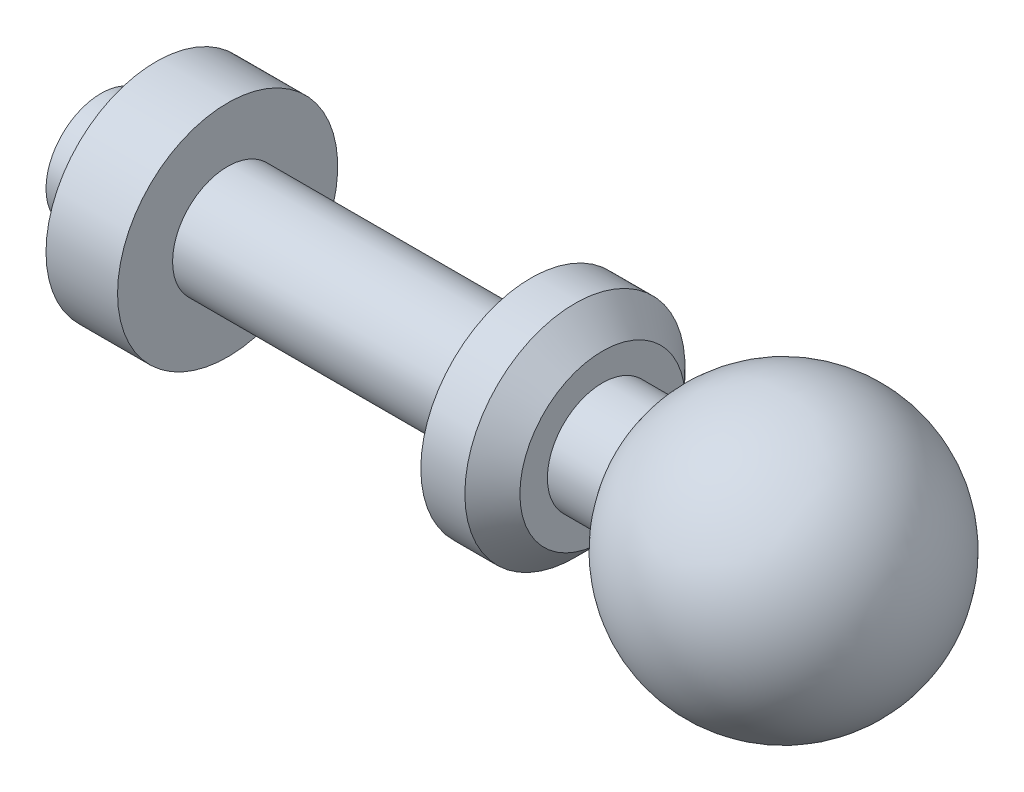
ISO-10303-21;
HEADER;
FILE_DESCRIPTION(('STEP AP214'),'2;1');
FILE_NAME('part.step','',(''),(''),'','','');
FILE_SCHEMA(('AUTOMOTIVE_DESIGN { 1 0 10303 214 1 1 1 1 }'));
ENDSEC;
DATA;
#1=APPLICATION_CONTEXT('core data for automotive mechanical design processes');
#2=APPLICATION_PROTOCOL_DEFINITION('international standard','automotive_design',2000,#1);
#3=PRODUCT_CONTEXT('',#1,'mechanical');
#4=PRODUCT('Part','Part','',(#3));
#5=PRODUCT_RELATED_PRODUCT_CATEGORY('part','',(#4));
#6=PRODUCT_DEFINITION_FORMATION('','',#4);
#7=PRODUCT_DEFINITION_CONTEXT('part definition',#1,'design');
#8=PRODUCT_DEFINITION('design','',#6,#7);
#9=PRODUCT_DEFINITION_SHAPE('','',#8);
#10=(LENGTH_UNIT() NAMED_UNIT(*) SI_UNIT(.MILLI.,.METRE.));
#11=(NAMED_UNIT(*) PLANE_ANGLE_UNIT() SI_UNIT($,.RADIAN.));
#12=(NAMED_UNIT(*) SI_UNIT($,.STERADIAN.) SOLID_ANGLE_UNIT());
#13=UNCERTAINTY_MEASURE_WITH_UNIT(LENGTH_MEASURE(1.E-05),#10,'distance_accuracy_value','');
#14=(GEOMETRIC_REPRESENTATION_CONTEXT(3) GLOBAL_UNCERTAINTY_ASSIGNED_CONTEXT((#13)) GLOBAL_UNIT_ASSIGNED_CONTEXT((#10,
#11,#12)) REPRESENTATION_CONTEXT('',''));
#15=CARTESIAN_POINT('',(0.,0.,0.));
#16=DIRECTION('',(0.,0.,1.));
#17=DIRECTION('',(1.,0.,0.));
#18=AXIS2_PLACEMENT_3D('',#15,#16,#17);
#19=CARTESIAN_POINT('',(124.012878474779,0.,0.));
#20=DIRECTION('',(-1.,0.,0.));
#21=DIRECTION('',(0.,1.,0.));
#22=AXIS2_PLACEMENT_3D('',#19,#20,#21);
#23=SPHERICAL_SURFACE('',#22,25.);
#24=CARTESIAN_POINT('',(101.1,0.,0.));
#25=DIRECTION('',(-1.,0.,0.));
#26=DIRECTION('',(0.,0.,1.));
#27=AXIS2_PLACEMENT_3D('',#24,#25,#26);
#28=CIRCLE('',#27,10.);
#29=CARTESIAN_POINT('',(101.1,0.,10.));
#30=VERTEX_POINT('',#29);
#31=EDGE_CURVE('E10',#30,#30,#28,.T.);
#32=ORIENTED_EDGE('',*,*,#31,.F.);
#33=EDGE_LOOP('',(#32));
#34=FACE_BOUND('',#33,.T.);
#35=ADVANCED_FACE('F31',(#34),#23,.T.);
#36=CARTESIAN_POINT('',(0.,0.,0.));
#37=DIRECTION('',(-1.,0.,0.));
#38=DIRECTION('',(0.,0.,1.));
#39=AXIS2_PLACEMENT_3D('',#36,#37,#38);
#40=CYLINDRICAL_SURFACE('',#39,10.);
#41=CARTESIAN_POINT('',(91.1,0.,0.));
#42=DIRECTION('',(-1.,0.,0.));
#43=DIRECTION('',(0.,0.,1.));
#44=AXIS2_PLACEMENT_3D('',#41,#42,#43);
#45=CIRCLE('',#44,10.);
#46=CARTESIAN_POINT('',(91.1,0.,10.));
#47=VERTEX_POINT('',#46);
#48=EDGE_CURVE('E37',#47,#47,#45,.T.);
#49=ORIENTED_EDGE('',*,*,#48,.F.);
#50=EDGE_LOOP('',(#49));
#51=FACE_BOUND('',#50,.T.);
#52=ORIENTED_EDGE('',*,*,#31,.T.);
#53=EDGE_LOOP('',(#52));
#54=FACE_BOUND('',#53,.T.);
#55=ADVANCED_FACE('F124',(#51,#54),#40,.T.);
#56=CARTESIAN_POINT('',(91.1,15.,0.));
#57=DIRECTION('',(-1.,0.,0.));
#58=DIRECTION('',(0.,0.,1.));
#59=AXIS2_PLACEMENT_3D('',#56,#57,#58);
#60=PLANE('',#59);
#61=CARTESIAN_POINT('',(91.1,0.,0.));
#62=DIRECTION('',(-1.,0.,0.));
#63=DIRECTION('',(0.,0.,1.));
#64=AXIS2_PLACEMENT_3D('',#61,#62,#63);
#65=CIRCLE('',#64,15.);
#66=CARTESIAN_POINT('',(91.1,0.,15.));
#67=VERTEX_POINT('',#66);
#68=EDGE_CURVE('E41',#67,#67,#65,.T.);
#69=ORIENTED_EDGE('',*,*,#68,.F.);
#70=EDGE_LOOP('',(#69));
#71=FACE_BOUND('',#70,.T.);
#72=ORIENTED_EDGE('',*,*,#48,.T.);
#73=EDGE_LOOP('',(#72));
#74=FACE_BOUND('',#73,.T.);
#75=ADVANCED_FACE('F119',(#71,#74),#60,.F.);
#76=CARTESIAN_POINT('',(91.1,0.,0.));
#77=DIRECTION('',(-1.,0.,0.));
#78=DIRECTION('',(0.,0.,1.));
#79=AXIS2_PLACEMENT_3D('',#76,#77,#78);
#80=CONICAL_SURFACE('',#79,15.,0.785398163397447);
#81=CARTESIAN_POINT('',(86.1,0.,0.));
#82=DIRECTION('',(-1.,0.,0.));
#83=DIRECTION('',(0.,0.,1.));
#84=AXIS2_PLACEMENT_3D('',#81,#82,#83);
#85=CIRCLE('',#84,20.);
#86=CARTESIAN_POINT('',(86.1,0.,20.));
#87=VERTEX_POINT('',#86);
#88=EDGE_CURVE('E45',#87,#87,#85,.T.);
#89=ORIENTED_EDGE('',*,*,#88,.F.);
#90=EDGE_LOOP('',(#89));
#91=FACE_BOUND('',#90,.T.);
#92=ORIENTED_EDGE('',*,*,#68,.T.);
#93=EDGE_LOOP('',(#92));
#94=FACE_BOUND('',#93,.T.);
#95=ADVANCED_FACE('F113',(#91,#94),#80,.T.);
#96=CARTESIAN_POINT('',(0.,0.,0.));
#97=DIRECTION('',(-1.,0.,0.));
#98=DIRECTION('',(0.,0.,1.));
#99=AXIS2_PLACEMENT_3D('',#96,#97,#98);
#100=CYLINDRICAL_SURFACE('',#99,20.);
#101=CARTESIAN_POINT('',(78.1,0.,0.));
#102=DIRECTION('',(-1.,0.,0.));
#103=DIRECTION('',(0.,0.,1.));
#104=AXIS2_PLACEMENT_3D('',#101,#102,#103);
#105=CIRCLE('',#104,20.);
#106=CARTESIAN_POINT('',(78.1,0.,20.));
#107=VERTEX_POINT('',#106);
#108=EDGE_CURVE('E50',#107,#107,#105,.T.);
#109=ORIENTED_EDGE('',*,*,#108,.F.);
#110=EDGE_LOOP('',(#109));
#111=FACE_BOUND('',#110,.T.);
#112=ORIENTED_EDGE('',*,*,#88,.T.);
#113=EDGE_LOOP('',(#112));
#114=FACE_BOUND('',#113,.T.);
#115=ADVANCED_FACE('F107',(#111,#114),#100,.T.);
#116=CARTESIAN_POINT('',(78.1,10.,0.));
#117=DIRECTION('',(1.,0.,0.));
#118=DIRECTION('',(0.,0.,-1.));
#119=AXIS2_PLACEMENT_3D('',#116,#117,#118);
#120=PLANE('',#119);
#121=CARTESIAN_POINT('',(78.1,0.,0.));
#122=DIRECTION('',(-1.,0.,0.));
#123=DIRECTION('',(0.,0.,1.));
#124=AXIS2_PLACEMENT_3D('',#121,#122,#123);
#125=CIRCLE('',#124,10.);
#126=CARTESIAN_POINT('',(78.1,0.,10.));
#127=VERTEX_POINT('',#126);
#128=EDGE_CURVE('E53',#127,#127,#125,.T.);
#129=ORIENTED_EDGE('',*,*,#128,.F.);
#130=EDGE_LOOP('',(#129));
#131=FACE_BOUND('',#130,.T.);
#132=ORIENTED_EDGE('',*,*,#108,.T.);
#133=EDGE_LOOP('',(#132));
#134=FACE_BOUND('',#133,.T.);
#135=ADVANCED_FACE('F101',(#131,#134),#120,.F.);
#136=CARTESIAN_POINT('',(0.,0.,0.));
#137=DIRECTION('',(-1.,0.,0.));
#138=DIRECTION('',(0.,0.,1.));
#139=AXIS2_PLACEMENT_3D('',#136,#137,#138);
#140=CYLINDRICAL_SURFACE('',#139,10.);
#141=CARTESIAN_POINT('',(23.,0.,0.));
#142=DIRECTION('',(-1.,0.,0.));
#143=DIRECTION('',(0.,0.,1.));
#144=AXIS2_PLACEMENT_3D('',#141,#142,#143);
#145=CIRCLE('',#144,10.);
#146=CARTESIAN_POINT('',(23.,0.,10.));
#147=VERTEX_POINT('',#146);
#148=EDGE_CURVE('E56',#147,#147,#145,.T.);
#149=ORIENTED_EDGE('',*,*,#148,.F.);
#150=EDGE_LOOP('',(#149));
#151=FACE_BOUND('',#150,.T.);
#152=ORIENTED_EDGE('',*,*,#128,.T.);
#153=EDGE_LOOP('',(#152));
#154=FACE_BOUND('',#153,.T.);
#155=ADVANCED_FACE('F95',(#151,#154),#140,.T.);
#156=CARTESIAN_POINT('',(23.,20.,0.));
#157=DIRECTION('',(-1.,0.,0.));
#158=DIRECTION('',(0.,0.,1.));
#159=AXIS2_PLACEMENT_3D('',#156,#157,#158);
#160=PLANE('',#159);
#161=CARTESIAN_POINT('',(23.,0.,0.));
#162=DIRECTION('',(-1.,0.,0.));
#163=DIRECTION('',(0.,0.,1.));
#164=AXIS2_PLACEMENT_3D('',#161,#162,#163);
#165=CIRCLE('',#164,20.);
#166=CARTESIAN_POINT('',(23.,0.,20.));
#167=VERTEX_POINT('',#166);
#168=EDGE_CURVE('E59',#167,#167,#165,.T.);
#169=ORIENTED_EDGE('',*,*,#168,.F.);
#170=EDGE_LOOP('',(#169));
#171=FACE_BOUND('',#170,.T.);
#172=ORIENTED_EDGE('',*,*,#148,.T.);
#173=EDGE_LOOP('',(#172));
#174=FACE_BOUND('',#173,.T.);
#175=ADVANCED_FACE('F89',(#171,#174),#160,.F.);
#176=CARTESIAN_POINT('',(0.,0.,0.));
#177=DIRECTION('',(-1.,0.,0.));
#178=DIRECTION('',(0.,0.,1.));
#179=AXIS2_PLACEMENT_3D('',#176,#177,#178);
#180=CYLINDRICAL_SURFACE('',#179,20.);
#181=CARTESIAN_POINT('',(10.,0.,0.));
#182=DIRECTION('',(-1.,0.,0.));
#183=DIRECTION('',(0.,0.,1.));
#184=AXIS2_PLACEMENT_3D('',#181,#182,#183);
#185=CIRCLE('',#184,20.);
#186=CARTESIAN_POINT('',(10.,0.,20.));
#187=VERTEX_POINT('',#186);
#188=EDGE_CURVE('E62',#187,#187,#185,.T.);
#189=ORIENTED_EDGE('',*,*,#188,.F.);
#190=EDGE_LOOP('',(#189));
#191=FACE_BOUND('',#190,.T.);
#192=ORIENTED_EDGE('',*,*,#168,.T.);
#193=EDGE_LOOP('',(#192));
#194=FACE_BOUND('',#193,.T.);
#195=ADVANCED_FACE('F83',(#191,#194),#180,.T.);
#196=CARTESIAN_POINT('',(10.,10.,0.));
#197=DIRECTION('',(1.,0.,0.));
#198=DIRECTION('',(0.,0.,-1.));
#199=AXIS2_PLACEMENT_3D('',#196,#197,#198);
#200=PLANE('',#199);
#201=CARTESIAN_POINT('',(10.,0.,0.));
#202=DIRECTION('',(-1.,0.,0.));
#203=DIRECTION('',(0.,0.,1.));
#204=AXIS2_PLACEMENT_3D('',#201,#202,#203);
#205=CIRCLE('',#204,10.);
#206=CARTESIAN_POINT('',(10.,0.,10.));
#207=VERTEX_POINT('',#206);
#208=EDGE_CURVE('E65',#207,#207,#205,.T.);
#209=ORIENTED_EDGE('',*,*,#208,.F.);
#210=EDGE_LOOP('',(#209));
#211=FACE_BOUND('',#210,.T.);
#212=ORIENTED_EDGE('',*,*,#188,.T.);
#213=EDGE_LOOP('',(#212));
#214=FACE_BOUND('',#213,.T.);
#215=ADVANCED_FACE('F77',(#211,#214),#200,.F.);
#216=CARTESIAN_POINT('',(0.,0.,0.));
#217=DIRECTION('',(-1.,0.,0.));
#218=DIRECTION('',(0.,0.,1.));
#219=AXIS2_PLACEMENT_3D('',#216,#217,#218);
#220=CYLINDRICAL_SURFACE('',#219,10.);
#221=CARTESIAN_POINT('',(0.,0.,0.));
#222=DIRECTION('',(-1.,0.,0.));
#223=DIRECTION('',(0.,0.,1.));
#224=AXIS2_PLACEMENT_3D('',#221,#222,#223);
#225=CIRCLE('',#224,10.);
#226=CARTESIAN_POINT('',(0.,0.,10.));
#227=VERTEX_POINT('',#226);
#228=EDGE_CURVE('E68',#227,#227,#225,.T.);
#229=ORIENTED_EDGE('',*,*,#228,.F.);
#230=EDGE_LOOP('',(#229));
#231=FACE_BOUND('',#230,.T.);
#232=ORIENTED_EDGE('',*,*,#208,.T.);
#233=EDGE_LOOP('',(#232));
#234=FACE_BOUND('',#233,.T.);
#235=ADVANCED_FACE('F74',(#231,#234),#220,.T.);
#236=CARTESIAN_POINT('',(0.,0.,0.));
#237=DIRECTION('',(1.,0.,0.));
#238=DIRECTION('',(0.,0.,-1.));
#239=AXIS2_PLACEMENT_3D('',#236,#237,#238);
#240=PLANE('',#239);
#241=ORIENTED_EDGE('',*,*,#228,.T.);
#242=EDGE_LOOP('',(#241));
#243=FACE_BOUND('',#242,.T.);
#244=ADVANCED_FACE('F72',(#243),#240,.F.);
#245=CLOSED_SHELL('',(#35,#55,#75,#95,#115,#135,#155,#175,#195,#215,#235,#244));
#246=MANIFOLD_SOLID_BREP('B2',#245);
#247=ADVANCED_BREP_SHAPE_REPRESENTATION('',(#18,#246),#14);
#248=SHAPE_DEFINITION_REPRESENTATION(#9,#247);
ENDSEC;
END-ISO-10303-21;
